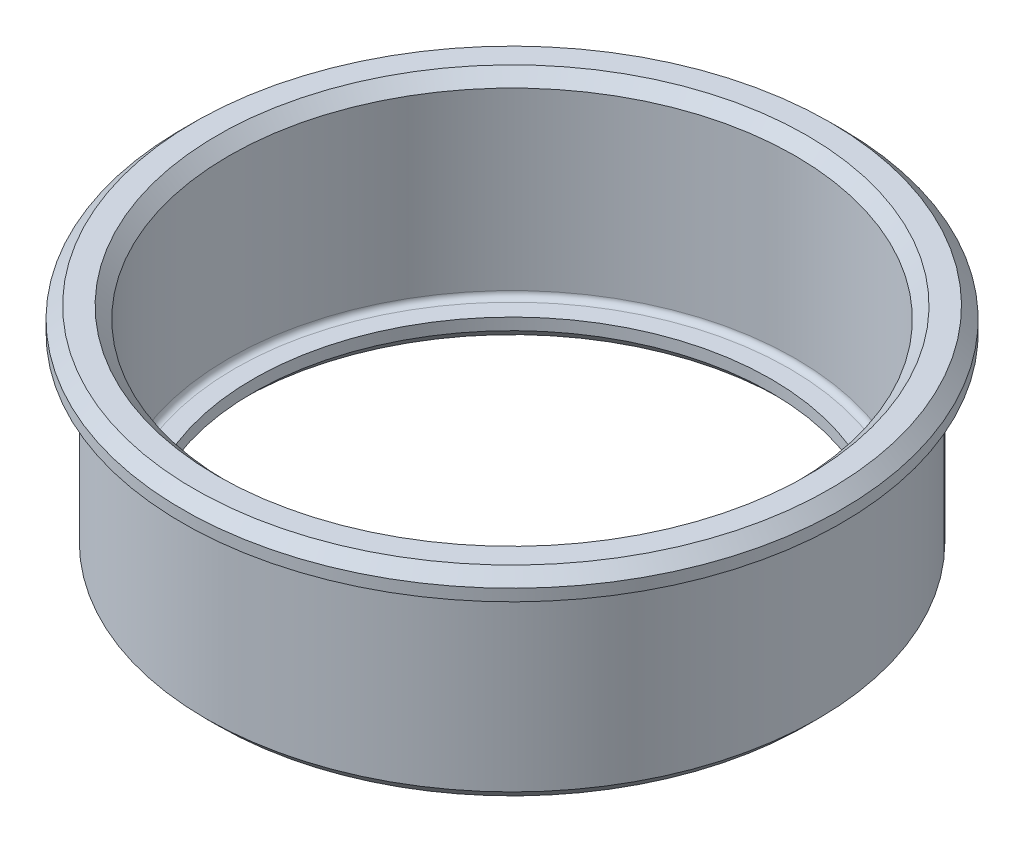
ISO-10303-21;
HEADER;
FILE_DESCRIPTION(('STEP AP214'),'2;1');
FILE_NAME('part.step','',(''),(''),'','','');
FILE_SCHEMA(('AUTOMOTIVE_DESIGN { 1 0 10303 214 1 1 1 1 }'));
ENDSEC;
DATA;
#1=APPLICATION_CONTEXT('core data for automotive mechanical design processes');
#2=APPLICATION_PROTOCOL_DEFINITION('international standard','automotive_design',2000,#1);
#3=PRODUCT_CONTEXT('',#1,'mechanical');
#4=PRODUCT('Part','Part','',(#3));
#5=PRODUCT_RELATED_PRODUCT_CATEGORY('part','',(#4));
#6=PRODUCT_DEFINITION_FORMATION('','',#4);
#7=PRODUCT_DEFINITION_CONTEXT('part definition',#1,'design');
#8=PRODUCT_DEFINITION('design','',#6,#7);
#9=PRODUCT_DEFINITION_SHAPE('','',#8);
#10=(LENGTH_UNIT() NAMED_UNIT(*) SI_UNIT(.MILLI.,.METRE.));
#11=(NAMED_UNIT(*) PLANE_ANGLE_UNIT() SI_UNIT($,.RADIAN.));
#12=(NAMED_UNIT(*) SI_UNIT($,.STERADIAN.) SOLID_ANGLE_UNIT());
#13=UNCERTAINTY_MEASURE_WITH_UNIT(LENGTH_MEASURE(1.E-05),#10,'distance_accuracy_value','');
#14=(GEOMETRIC_REPRESENTATION_CONTEXT(3) GLOBAL_UNCERTAINTY_ASSIGNED_CONTEXT((#13)) GLOBAL_UNIT_ASSIGNED_CONTEXT((#10,
#11,#12)) REPRESENTATION_CONTEXT('',''));
#15=CARTESIAN_POINT('',(0.,0.,0.));
#16=DIRECTION('',(0.,0.,1.));
#17=DIRECTION('',(1.,0.,0.));
#18=AXIS2_PLACEMENT_3D('',#15,#16,#17);
#19=CARTESIAN_POINT('',(0.,0.,-11.775));
#20=DIRECTION('',(0.,1.,0.));
#21=DIRECTION('',(0.,0.,1.));
#22=AXIS2_PLACEMENT_3D('',#19,#20,#21);
#23=PLANE('',#22);
#24=CARTESIAN_POINT('',(0.,0.,0.));
#25=DIRECTION('',(0.,-1.,0.));
#26=DIRECTION('',(0.,0.,-1.));
#27=AXIS2_PLACEMENT_3D('',#24,#25,#26);
#28=CIRCLE('',#27,11.);
#29=CARTESIAN_POINT('',(0.,0.,-11.));
#30=VERTEX_POINT('',#29);
#31=EDGE_CURVE('E89',#30,#30,#28,.T.);
#32=ORIENTED_EDGE('',*,*,#31,.T.);
#33=EDGE_LOOP('',(#32));
#34=FACE_BOUND('',#33,.T.);
#35=CARTESIAN_POINT('',(0.,0.,0.));
#36=DIRECTION('',(0.,-1.,0.));
#37=DIRECTION('',(0.,0.,-1.));
#38=AXIS2_PLACEMENT_3D('',#35,#36,#37);
#39=CIRCLE('',#38,11.775);
#40=CARTESIAN_POINT('',(0.,0.,-11.775));
#41=VERTEX_POINT('',#40);
#42=EDGE_CURVE('E10',#41,#41,#39,.T.);
#43=ORIENTED_EDGE('',*,*,#42,.F.);
#44=EDGE_LOOP('',(#43));
#45=FACE_BOUND('',#44,.T.);
#46=ADVANCED_FACE('F43',(#34,#45),#23,.T.);
#47=CARTESIAN_POINT('',(0.,0.25,0.));
#48=DIRECTION('',(0.,-1.,0.));
#49=DIRECTION('',(0.,0.,-1.));
#50=AXIS2_PLACEMENT_3D('',#47,#48,#49);
#51=TOROIDAL_SURFACE('',#50,11.775,0.25);
#52=ORIENTED_EDGE('',*,*,#42,.T.);
#53=EDGE_LOOP('',(#52));
#54=FACE_BOUND('',#53,.T.);
#55=CARTESIAN_POINT('',(0.,0.250000000000002,0.));
#56=DIRECTION('',(0.,-1.,0.));
#57=DIRECTION('',(0.,0.,-1.));
#58=AXIS2_PLACEMENT_3D('',#55,#56,#57);
#59=CIRCLE('',#58,12.025);
#60=CARTESIAN_POINT('',(0.,0.250000000000002,-12.025));
#61=VERTEX_POINT('',#60);
#62=EDGE_CURVE('E49',#61,#61,#59,.T.);
#63=ORIENTED_EDGE('',*,*,#62,.F.);
#64=EDGE_LOOP('',(#63));
#65=FACE_BOUND('',#64,.T.);
#66=ADVANCED_FACE('F107',(#54,#65),#51,.F.);
#67=CARTESIAN_POINT('',(0.,0.,0.));
#68=DIRECTION('',(0.,-1.,0.));
#69=DIRECTION('',(0.,0.,-1.));
#70=AXIS2_PLACEMENT_3D('',#67,#68,#69);
#71=CYLINDRICAL_SURFACE('',#70,12.025);
#72=ORIENTED_EDGE('',*,*,#62,.T.);
#73=EDGE_LOOP('',(#72));
#74=FACE_BOUND('',#73,.T.);
#75=CARTESIAN_POINT('',(0.,7.7,0.));
#76=DIRECTION('',(0.,-1.,0.));
#77=DIRECTION('',(0.,0.,-1.));
#78=AXIS2_PLACEMENT_3D('',#75,#76,#77);
#79=CIRCLE('',#78,12.025);
#80=CARTESIAN_POINT('',(0.,7.7,-12.025));
#81=VERTEX_POINT('',#80);
#82=EDGE_CURVE('E53',#81,#81,#79,.T.);
#83=ORIENTED_EDGE('',*,*,#82,.F.);
#84=EDGE_LOOP('',(#83));
#85=FACE_BOUND('',#84,.T.);
#86=ADVANCED_FACE('F111',(#74,#85),#71,.F.);
#87=CARTESIAN_POINT('',(0.,8.2,0.));
#88=DIRECTION('',(0.,1.,0.));
#89=DIRECTION('',(0.,0.,1.));
#90=AXIS2_PLACEMENT_3D('',#87,#88,#89);
#91=CONICAL_SURFACE('',#90,12.525,0.785398163397448);
#92=ORIENTED_EDGE('',*,*,#82,.T.);
#93=EDGE_LOOP('',(#92));
#94=FACE_BOUND('',#93,.T.);
#95=CARTESIAN_POINT('',(0.,8.2,0.));
#96=DIRECTION('',(0.,-1.,0.));
#97=DIRECTION('',(0.,0.,-1.));
#98=AXIS2_PLACEMENT_3D('',#95,#96,#97);
#99=CIRCLE('',#98,12.525);
#100=CARTESIAN_POINT('',(0.,8.2,-12.525));
#101=VERTEX_POINT('',#100);
#102=EDGE_CURVE('E57',#101,#101,#99,.T.);
#103=ORIENTED_EDGE('',*,*,#102,.F.);
#104=EDGE_LOOP('',(#103));
#105=FACE_BOUND('',#104,.T.);
#106=ADVANCED_FACE('F115',(#94,#105),#91,.F.);
#107=CARTESIAN_POINT('',(0.,8.2,-13.5));
#108=DIRECTION('',(0.,1.,0.));
#109=DIRECTION('',(0.,0.,1.));
#110=AXIS2_PLACEMENT_3D('',#107,#108,#109);
#111=PLANE('',#110);
#112=ORIENTED_EDGE('',*,*,#102,.T.);
#113=EDGE_LOOP('',(#112));
#114=FACE_BOUND('',#113,.T.);
#115=CARTESIAN_POINT('',(0.,8.2,0.));
#116=DIRECTION('',(0.,-1.,0.));
#117=DIRECTION('',(0.,0.,-1.));
#118=AXIS2_PLACEMENT_3D('',#115,#116,#117);
#119=CIRCLE('',#118,13.5);
#120=CARTESIAN_POINT('',(0.,8.2,-13.5));
#121=VERTEX_POINT('',#120);
#122=EDGE_CURVE('E62',#121,#121,#119,.T.);
#123=ORIENTED_EDGE('',*,*,#122,.F.);
#124=EDGE_LOOP('',(#123));
#125=FACE_BOUND('',#124,.T.);
#126=ADVANCED_FACE('F121',(#114,#125),#111,.T.);
#127=CARTESIAN_POINT('',(0.,7.7,0.));
#128=DIRECTION('',(0.,-1.,0.));
#129=DIRECTION('',(0.,0.,-1.));
#130=AXIS2_PLACEMENT_3D('',#127,#128,#129);
#131=CONICAL_SURFACE('',#130,14.,0.785398163397448);
#132=ORIENTED_EDGE('',*,*,#122,.T.);
#133=EDGE_LOOP('',(#132));
#134=FACE_BOUND('',#133,.T.);
#135=CARTESIAN_POINT('',(0.,7.7,0.));
#136=DIRECTION('',(0.,-1.,0.));
#137=DIRECTION('',(0.,0.,-1.));
#138=AXIS2_PLACEMENT_3D('',#135,#136,#137);
#139=CIRCLE('',#138,14.);
#140=CARTESIAN_POINT('',(0.,7.7,-14.));
#141=VERTEX_POINT('',#140);
#142=EDGE_CURVE('E65',#141,#141,#139,.T.);
#143=ORIENTED_EDGE('',*,*,#142,.F.);
#144=EDGE_LOOP('',(#143));
#145=FACE_BOUND('',#144,.T.);
#146=ADVANCED_FACE('F125',(#134,#145),#131,.T.);
#147=CARTESIAN_POINT('',(0.,0.,0.));
#148=DIRECTION('',(0.,-1.,0.));
#149=DIRECTION('',(0.,0.,-1.));
#150=AXIS2_PLACEMENT_3D('',#147,#148,#149);
#151=CYLINDRICAL_SURFACE('',#150,14.);
#152=ORIENTED_EDGE('',*,*,#142,.T.);
#153=EDGE_LOOP('',(#152));
#154=FACE_BOUND('',#153,.T.);
#155=CARTESIAN_POINT('',(0.,7.2,0.));
#156=DIRECTION('',(0.,-1.,0.));
#157=DIRECTION('',(0.,0.,-1.));
#158=AXIS2_PLACEMENT_3D('',#155,#156,#157);
#159=CIRCLE('',#158,14.);
#160=CARTESIAN_POINT('',(0.,7.2,-14.));
#161=VERTEX_POINT('',#160);
#162=EDGE_CURVE('E68',#161,#161,#159,.T.);
#163=ORIENTED_EDGE('',*,*,#162,.F.);
#164=EDGE_LOOP('',(#163));
#165=FACE_BOUND('',#164,.T.);
#166=ADVANCED_FACE('F129',(#154,#165),#151,.T.);
#167=CARTESIAN_POINT('',(0.,7.2,-13.25));
#168=DIRECTION('',(0.,-1.,0.));
#169=DIRECTION('',(0.,0.,-1.));
#170=AXIS2_PLACEMENT_3D('',#167,#168,#169);
#171=PLANE('',#170);
#172=ORIENTED_EDGE('',*,*,#162,.T.);
#173=EDGE_LOOP('',(#172));
#174=FACE_BOUND('',#173,.T.);
#175=CARTESIAN_POINT('',(0.,7.2,0.));
#176=DIRECTION('',(0.,-1.,0.));
#177=DIRECTION('',(0.,0.,-1.));
#178=AXIS2_PLACEMENT_3D('',#175,#176,#177);
#179=CIRCLE('',#178,13.25);
#180=CARTESIAN_POINT('',(0.,7.2,-13.25));
#181=VERTEX_POINT('',#180);
#182=EDGE_CURVE('E71',#181,#181,#179,.T.);
#183=ORIENTED_EDGE('',*,*,#182,.F.);
#184=EDGE_LOOP('',(#183));
#185=FACE_BOUND('',#184,.T.);
#186=ADVANCED_FACE('F133',(#174,#185),#171,.T.);
#187=CARTESIAN_POINT('',(0.,6.95,0.));
#188=DIRECTION('',(0.,-1.,0.));
#189=DIRECTION('',(0.,0.,-1.));
#190=AXIS2_PLACEMENT_3D('',#187,#188,#189);
#191=TOROIDAL_SURFACE('',#190,13.25,0.25);
#192=ORIENTED_EDGE('',*,*,#182,.T.);
#193=EDGE_LOOP('',(#192));
#194=FACE_BOUND('',#193,.T.);
#195=CARTESIAN_POINT('',(0.,6.95,0.));
#196=DIRECTION('',(0.,-1.,0.));
#197=DIRECTION('',(0.,0.,-1.));
#198=AXIS2_PLACEMENT_3D('',#195,#196,#197);
#199=CIRCLE('',#198,13.);
#200=CARTESIAN_POINT('',(0.,6.95,-13.));
#201=VERTEX_POINT('',#200);
#202=EDGE_CURVE('E74',#201,#201,#199,.T.);
#203=ORIENTED_EDGE('',*,*,#202,.F.);
#204=EDGE_LOOP('',(#203));
#205=FACE_BOUND('',#204,.T.);
#206=ADVANCED_FACE('F137',(#194,#205),#191,.F.);
#207=CARTESIAN_POINT('',(0.,0.,0.));
#208=DIRECTION('',(0.,-1.,0.));
#209=DIRECTION('',(0.,0.,-1.));
#210=AXIS2_PLACEMENT_3D('',#207,#208,#209);
#211=CYLINDRICAL_SURFACE('',#210,13.);
#212=ORIENTED_EDGE('',*,*,#202,.T.);
#213=EDGE_LOOP('',(#212));
#214=FACE_BOUND('',#213,.T.);
#215=CARTESIAN_POINT('',(0.,-0.5,0.));
#216=DIRECTION('',(0.,-1.,0.));
#217=DIRECTION('',(0.,0.,-1.));
#218=AXIS2_PLACEMENT_3D('',#215,#216,#217);
#219=CIRCLE('',#218,13.);
#220=CARTESIAN_POINT('',(0.,-0.5,-13.));
#221=VERTEX_POINT('',#220);
#222=EDGE_CURVE('E77',#221,#221,#219,.T.);
#223=ORIENTED_EDGE('',*,*,#222,.F.);
#224=EDGE_LOOP('',(#223));
#225=FACE_BOUND('',#224,.T.);
#226=ADVANCED_FACE('F141',(#214,#225),#211,.T.);
#227=CARTESIAN_POINT('',(0.,-1.,0.));
#228=DIRECTION('',(0.,1.,0.));
#229=DIRECTION('',(0.,0.,1.));
#230=AXIS2_PLACEMENT_3D('',#227,#228,#229);
#231=CONICAL_SURFACE('',#230,12.5,0.785398163397449);
#232=ORIENTED_EDGE('',*,*,#222,.T.);
#233=EDGE_LOOP('',(#232));
#234=FACE_BOUND('',#233,.T.);
#235=CARTESIAN_POINT('',(0.,-1.,0.));
#236=DIRECTION('',(0.,-1.,0.));
#237=DIRECTION('',(0.,0.,-1.));
#238=AXIS2_PLACEMENT_3D('',#235,#236,#237);
#239=CIRCLE('',#238,12.5);
#240=CARTESIAN_POINT('',(0.,-1.,-12.5));
#241=VERTEX_POINT('',#240);
#242=EDGE_CURVE('E80',#241,#241,#239,.T.);
#243=ORIENTED_EDGE('',*,*,#242,.F.);
#244=EDGE_LOOP('',(#243));
#245=FACE_BOUND('',#244,.T.);
#246=ADVANCED_FACE('F145',(#234,#245),#231,.T.);
#247=CARTESIAN_POINT('',(0.,-1.,-11.5));
#248=DIRECTION('',(0.,-1.,0.));
#249=DIRECTION('',(0.,0.,-1.));
#250=AXIS2_PLACEMENT_3D('',#247,#248,#249);
#251=PLANE('',#250);
#252=ORIENTED_EDGE('',*,*,#242,.T.);
#253=EDGE_LOOP('',(#252));
#254=FACE_BOUND('',#253,.T.);
#255=CARTESIAN_POINT('',(0.,-1.,0.));
#256=DIRECTION('',(0.,-1.,0.));
#257=DIRECTION('',(0.,0.,-1.));
#258=AXIS2_PLACEMENT_3D('',#255,#256,#257);
#259=CIRCLE('',#258,11.5);
#260=CARTESIAN_POINT('',(0.,-1.,-11.5));
#261=VERTEX_POINT('',#260);
#262=EDGE_CURVE('E83',#261,#261,#259,.T.);
#263=ORIENTED_EDGE('',*,*,#262,.F.);
#264=EDGE_LOOP('',(#263));
#265=FACE_BOUND('',#264,.T.);
#266=ADVANCED_FACE('F103',(#254,#265),#251,.T.);
#267=CARTESIAN_POINT('',(0.,-0.5,0.));
#268=DIRECTION('',(0.,-1.,0.));
#269=DIRECTION('',(0.,0.,-1.));
#270=AXIS2_PLACEMENT_3D('',#267,#268,#269);
#271=CONICAL_SURFACE('',#270,11.,0.785398163397449);
#272=ORIENTED_EDGE('',*,*,#262,.T.);
#273=EDGE_LOOP('',(#272));
#274=FACE_BOUND('',#273,.T.);
#275=CARTESIAN_POINT('',(0.,-0.5,0.));
#276=DIRECTION('',(0.,-1.,0.));
#277=DIRECTION('',(0.,0.,-1.));
#278=AXIS2_PLACEMENT_3D('',#275,#276,#277);
#279=CIRCLE('',#278,11.);
#280=CARTESIAN_POINT('',(0.,-0.5,-11.));
#281=VERTEX_POINT('',#280);
#282=EDGE_CURVE('E86',#281,#281,#279,.T.);
#283=ORIENTED_EDGE('',*,*,#282,.F.);
#284=EDGE_LOOP('',(#283));
#285=FACE_BOUND('',#284,.T.);
#286=ADVANCED_FACE('F97',(#274,#285),#271,.F.);
#287=CARTESIAN_POINT('',(0.,0.,0.));
#288=DIRECTION('',(0.,-1.,0.));
#289=DIRECTION('',(0.,0.,-1.));
#290=AXIS2_PLACEMENT_3D('',#287,#288,#289);
#291=CYLINDRICAL_SURFACE('',#290,11.);
#292=ORIENTED_EDGE('',*,*,#282,.T.);
#293=EDGE_LOOP('',(#292));
#294=FACE_BOUND('',#293,.T.);
#295=ORIENTED_EDGE('',*,*,#31,.F.);
#296=EDGE_LOOP('',(#295));
#297=FACE_BOUND('',#296,.T.);
#298=ADVANCED_FACE('F95',(#294,#297),#291,.F.);
#299=CLOSED_SHELL('',(#46,#66,#86,#106,#126,#146,#166,#186,#206,#226,#246,#266,#286,#298));
#300=MANIFOLD_SOLID_BREP('B2',#299);
#301=ADVANCED_BREP_SHAPE_REPRESENTATION('',(#18,#300),#14);
#302=SHAPE_DEFINITION_REPRESENTATION(#9,#301);
ENDSEC;
END-ISO-10303-21;
